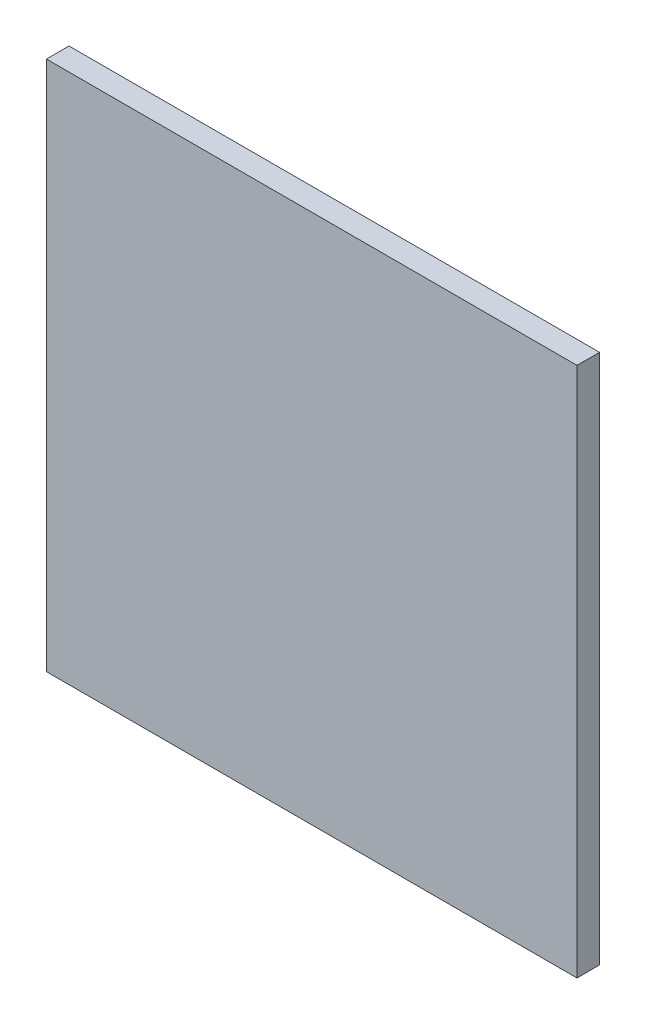
ISO-10303-21;
HEADER;
FILE_DESCRIPTION(('STEP AP214'),'2;1');
FILE_NAME('part.step','',(''),(''),'','','');
FILE_SCHEMA(('AUTOMOTIVE_DESIGN { 1 0 10303 214 1 1 1 1 }'));
ENDSEC;
DATA;
#1=APPLICATION_CONTEXT('core data for automotive mechanical design processes');
#2=APPLICATION_PROTOCOL_DEFINITION('international standard','automotive_design',2000,#1);
#3=PRODUCT_CONTEXT('',#1,'mechanical');
#4=PRODUCT('Part','Part','',(#3));
#5=PRODUCT_RELATED_PRODUCT_CATEGORY('part','',(#4));
#6=PRODUCT_DEFINITION_FORMATION('','',#4);
#7=PRODUCT_DEFINITION_CONTEXT('part definition',#1,'design');
#8=PRODUCT_DEFINITION('design','',#6,#7);
#9=PRODUCT_DEFINITION_SHAPE('','',#8);
#10=(LENGTH_UNIT() NAMED_UNIT(*) SI_UNIT(.MILLI.,.METRE.));
#11=(NAMED_UNIT(*) PLANE_ANGLE_UNIT() SI_UNIT($,.RADIAN.));
#12=(NAMED_UNIT(*) SI_UNIT($,.STERADIAN.) SOLID_ANGLE_UNIT());
#13=UNCERTAINTY_MEASURE_WITH_UNIT(LENGTH_MEASURE(1.E-05),#10,'distance_accuracy_value','');
#14=(GEOMETRIC_REPRESENTATION_CONTEXT(3) GLOBAL_UNCERTAINTY_ASSIGNED_CONTEXT((#13)) GLOBAL_UNIT_ASSIGNED_CONTEXT((#10,
#11,#12)) REPRESENTATION_CONTEXT('',''));
#15=CARTESIAN_POINT('',(0.,0.,0.));
#16=DIRECTION('',(0.,0.,1.));
#17=DIRECTION('',(1.,0.,0.));
#18=AXIS2_PLACEMENT_3D('',#15,#16,#17);
#19=CARTESIAN_POINT('',(-117.5,117.5,10.));
#20=DIRECTION('',(1.,0.,0.));
#21=DIRECTION('',(0.,1.,0.));
#22=AXIS2_PLACEMENT_3D('',#19,#20,#21);
#23=PLANE('',#22);
#24=DIRECTION('',(0.,-1.,0.));
#25=VECTOR('',#24,1.);
#26=CARTESIAN_POINT('',(-117.5,117.5,0.));
#27=LINE('',#26,#25);
#28=CARTESIAN_POINT('',(-117.5,117.5,0.));
#29=VERTEX_POINT('',#28);
#30=CARTESIAN_POINT('',(-117.5,-117.5,0.));
#31=VERTEX_POINT('',#30);
#32=EDGE_CURVE('E96',#29,#31,#27,.T.);
#33=ORIENTED_EDGE('',*,*,#32,.T.);
#34=DIRECTION('',(0.,0.,-1.));
#35=VECTOR('',#34,1.);
#36=CARTESIAN_POINT('',(-117.5,-117.5,10.));
#37=LINE('',#36,#35);
#38=CARTESIAN_POINT('',(-117.5,-117.5,10.));
#39=VERTEX_POINT('',#38);
#40=EDGE_CURVE('E11',#39,#31,#37,.T.);
#41=ORIENTED_EDGE('',*,*,#40,.F.);
#42=DIRECTION('',(0.,-1.,0.));
#43=VECTOR('',#42,1.);
#44=CARTESIAN_POINT('',(-117.5,117.5,10.));
#45=LINE('',#44,#43);
#46=CARTESIAN_POINT('',(-117.5,117.5,10.));
#47=VERTEX_POINT('',#46);
#48=EDGE_CURVE('E84',#47,#39,#45,.T.);
#49=ORIENTED_EDGE('',*,*,#48,.F.);
#50=DIRECTION('',(0.,0.,-1.));
#51=VECTOR('',#50,1.);
#52=CARTESIAN_POINT('',(-117.5,117.5,10.));
#53=LINE('',#52,#51);
#54=EDGE_CURVE('E92',#47,#29,#53,.T.);
#55=ORIENTED_EDGE('',*,*,#54,.T.);
#56=EDGE_LOOP('',(#33,#41,#49,#55));
#57=FACE_BOUND('',#56,.T.);
#58=ADVANCED_FACE('F33',(#57),#23,.F.);
#59=CARTESIAN_POINT('',(-117.5,-117.5,10.));
#60=DIRECTION('',(0.,1.,0.));
#61=DIRECTION('',(-1.,0.,0.));
#62=AXIS2_PLACEMENT_3D('',#59,#60,#61);
#63=PLANE('',#62);
#64=DIRECTION('',(1.,0.,0.));
#65=VECTOR('',#64,1.);
#66=CARTESIAN_POINT('',(-117.5,-117.5,0.));
#67=LINE('',#66,#65);
#68=CARTESIAN_POINT('',(117.5,-117.5,0.));
#69=VERTEX_POINT('',#68);
#70=EDGE_CURVE('E88',#31,#69,#67,.T.);
#71=ORIENTED_EDGE('',*,*,#70,.T.);
#72=DIRECTION('',(0.,0.,-1.));
#73=VECTOR('',#72,1.);
#74=CARTESIAN_POINT('',(117.5,-117.5,10.));
#75=LINE('',#74,#73);
#76=CARTESIAN_POINT('',(117.5,-117.5,10.));
#77=VERTEX_POINT('',#76);
#78=EDGE_CURVE('E41',#77,#69,#75,.T.);
#79=ORIENTED_EDGE('',*,*,#78,.F.);
#80=DIRECTION('',(1.,0.,0.));
#81=VECTOR('',#80,1.);
#82=CARTESIAN_POINT('',(-117.5,-117.5,10.));
#83=LINE('',#82,#81);
#84=EDGE_CURVE('E79',#39,#77,#83,.T.);
#85=ORIENTED_EDGE('',*,*,#84,.F.);
#86=ORIENTED_EDGE('',*,*,#40,.T.);
#87=EDGE_LOOP('',(#71,#79,#85,#86));
#88=FACE_BOUND('',#87,.T.);
#89=ADVANCED_FACE('F87',(#88),#63,.F.);
#90=CARTESIAN_POINT('',(117.5,117.5,10.));
#91=DIRECTION('',(-1.,0.,0.));
#92=DIRECTION('',(0.,0.,1.));
#93=AXIS2_PLACEMENT_3D('',#90,#91,#92);
#94=PLANE('',#93);
#95=DIRECTION('',(0.,1.,0.));
#96=VECTOR('',#95,1.);
#97=CARTESIAN_POINT('',(117.5,117.5,0.));
#98=LINE('',#97,#96);
#99=CARTESIAN_POINT('',(117.5,117.5,0.));
#100=VERTEX_POINT('',#99);
#101=EDGE_CURVE('E66',#69,#100,#98,.T.);
#102=ORIENTED_EDGE('',*,*,#101,.T.);
#103=DIRECTION('',(0.,0.,-1.));
#104=VECTOR('',#103,1.);
#105=CARTESIAN_POINT('',(117.5,117.5,10.));
#106=LINE('',#105,#104);
#107=CARTESIAN_POINT('',(117.5,117.5,10.));
#108=VERTEX_POINT('',#107);
#109=EDGE_CURVE('E89',#108,#100,#106,.T.);
#110=ORIENTED_EDGE('',*,*,#109,.F.);
#111=DIRECTION('',(0.,1.,0.));
#112=VECTOR('',#111,1.);
#113=CARTESIAN_POINT('',(117.5,117.5,10.));
#114=LINE('',#113,#112);
#115=EDGE_CURVE('E82',#77,#108,#114,.T.);
#116=ORIENTED_EDGE('',*,*,#115,.F.);
#117=ORIENTED_EDGE('',*,*,#78,.T.);
#118=EDGE_LOOP('',(#102,#110,#116,#117));
#119=FACE_BOUND('',#118,.T.);
#120=ADVANCED_FACE('F90',(#119),#94,.F.);
#121=CARTESIAN_POINT('',(-117.5,117.5,10.));
#122=DIRECTION('',(0.,-1.,0.));
#123=DIRECTION('',(0.,0.,-1.));
#124=AXIS2_PLACEMENT_3D('',#121,#122,#123);
#125=PLANE('',#124);
#126=DIRECTION('',(-1.,0.,0.));
#127=VECTOR('',#126,1.);
#128=CARTESIAN_POINT('',(-117.5,117.5,0.));
#129=LINE('',#128,#127);
#130=EDGE_CURVE('E72',#100,#29,#129,.T.);
#131=ORIENTED_EDGE('',*,*,#130,.T.);
#132=ORIENTED_EDGE('',*,*,#54,.F.);
#133=DIRECTION('',(-1.,0.,0.));
#134=VECTOR('',#133,1.);
#135=CARTESIAN_POINT('',(-117.5,117.5,10.));
#136=LINE('',#135,#134);
#137=EDGE_CURVE('E49',#108,#47,#136,.T.);
#138=ORIENTED_EDGE('',*,*,#137,.F.);
#139=ORIENTED_EDGE('',*,*,#109,.T.);
#140=EDGE_LOOP('',(#131,#132,#138,#139));
#141=FACE_BOUND('',#140,.T.);
#142=ADVANCED_FACE('F103',(#141),#125,.F.);
#143=CARTESIAN_POINT('',(0.,0.,10.));
#144=DIRECTION('',(0.,0.,1.));
#145=DIRECTION('',(1.,0.,0.));
#146=AXIS2_PLACEMENT_3D('',#143,#144,#145);
#147=PLANE('',#146);
#148=ORIENTED_EDGE('',*,*,#48,.T.);
#149=ORIENTED_EDGE('',*,*,#84,.T.);
#150=ORIENTED_EDGE('',*,*,#115,.T.);
#151=ORIENTED_EDGE('',*,*,#137,.T.);
#152=EDGE_LOOP('',(#148,#149,#150,#151));
#153=FACE_BOUND('',#152,.T.);
#154=ADVANCED_FACE('F80',(#153),#147,.T.);
#155=CARTESIAN_POINT('',(0.,0.,0.));
#156=DIRECTION('',(0.,0.,1.));
#157=DIRECTION('',(1.,0.,0.));
#158=AXIS2_PLACEMENT_3D('',#155,#156,#157);
#159=PLANE('',#158);
#160=ORIENTED_EDGE('',*,*,#32,.F.);
#161=ORIENTED_EDGE('',*,*,#130,.F.);
#162=ORIENTED_EDGE('',*,*,#101,.F.);
#163=ORIENTED_EDGE('',*,*,#70,.F.);
#164=EDGE_LOOP('',(#160,#161,#162,#163));
#165=FACE_BOUND('',#164,.T.);
#166=ADVANCED_FACE('F106',(#165),#159,.F.);
#167=CLOSED_SHELL('',(#58,#89,#120,#142,#154,#166));
#168=MANIFOLD_SOLID_BREP('B2',#167);
#169=ADVANCED_BREP_SHAPE_REPRESENTATION('',(#18,#168),#14);
#170=SHAPE_DEFINITION_REPRESENTATION(#9,#169);
ENDSEC;
END-ISO-10303-21;
